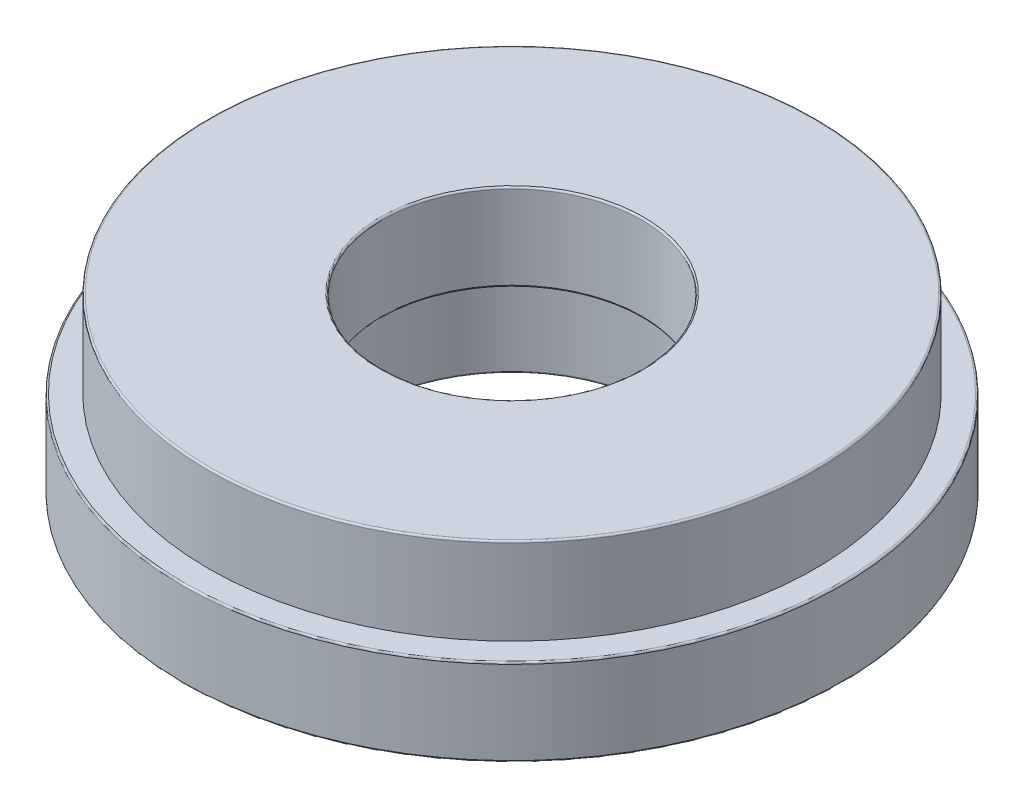
ISO-10303-21;
HEADER;
FILE_DESCRIPTION(('STEP AP214'),'2;1');
FILE_NAME('part.step','',(''),(''),'','','');
FILE_SCHEMA(('AUTOMOTIVE_DESIGN { 1 0 10303 214 1 1 1 1 }'));
ENDSEC;
DATA;
#1=APPLICATION_CONTEXT('core data for automotive mechanical design processes');
#2=APPLICATION_PROTOCOL_DEFINITION('international standard','automotive_design',2000,#1);
#3=PRODUCT_CONTEXT('',#1,'mechanical');
#4=PRODUCT('Part','Part','',(#3));
#5=PRODUCT_RELATED_PRODUCT_CATEGORY('part','',(#4));
#6=PRODUCT_DEFINITION_FORMATION('','',#4);
#7=PRODUCT_DEFINITION_CONTEXT('part definition',#1,'design');
#8=PRODUCT_DEFINITION('design','',#6,#7);
#9=PRODUCT_DEFINITION_SHAPE('','',#8);
#10=(LENGTH_UNIT() NAMED_UNIT(*) SI_UNIT(.MILLI.,.METRE.));
#11=(NAMED_UNIT(*) PLANE_ANGLE_UNIT() SI_UNIT($,.RADIAN.));
#12=(NAMED_UNIT(*) SI_UNIT($,.STERADIAN.) SOLID_ANGLE_UNIT());
#13=UNCERTAINTY_MEASURE_WITH_UNIT(LENGTH_MEASURE(1.E-05),#10,'distance_accuracy_value','');
#14=(GEOMETRIC_REPRESENTATION_CONTEXT(3) GLOBAL_UNCERTAINTY_ASSIGNED_CONTEXT((#13)) GLOBAL_UNIT_ASSIGNED_CONTEXT((#10,
#11,#12)) REPRESENTATION_CONTEXT('',''));
#15=CARTESIAN_POINT('',(0.,0.,0.));
#16=DIRECTION('',(0.,0.,1.));
#17=DIRECTION('',(1.,0.,0.));
#18=AXIS2_PLACEMENT_3D('',#15,#16,#17);
#19=CARTESIAN_POINT('',(0.,5.,0.));
#20=DIRECTION('',(0.,-1.,0.));
#21=DIRECTION('',(0.,0.,-1.));
#22=AXIS2_PLACEMENT_3D('',#19,#20,#21);
#23=CYLINDRICAL_SURFACE('',#22,19.);
#24=CARTESIAN_POINT('',(0.,0.1,0.));
#25=DIRECTION('',(0.,1.,0.));
#26=DIRECTION('',(0.,0.,1.));
#27=AXIS2_PLACEMENT_3D('',#24,#25,#26);
#28=CIRCLE('',#27,19.);
#29=CARTESIAN_POINT('',(0.,0.1,19.));
#30=VERTEX_POINT('',#29);
#31=EDGE_CURVE('E46',#30,#30,#28,.T.);
#32=ORIENTED_EDGE('',*,*,#31,.T.);
#33=EDGE_LOOP('',(#32));
#34=FACE_BOUND('',#33,.T.);
#35=CARTESIAN_POINT('',(0.,4.9,0.));
#36=DIRECTION('',(0.,1.,0.));
#37=DIRECTION('',(0.,0.,1.));
#38=AXIS2_PLACEMENT_3D('',#35,#36,#37);
#39=CIRCLE('',#38,19.);
#40=CARTESIAN_POINT('',(0.,4.9,19.));
#41=VERTEX_POINT('',#40);
#42=EDGE_CURVE('E50',#41,#41,#39,.F.);
#43=ORIENTED_EDGE('',*,*,#42,.T.);
#44=EDGE_LOOP('',(#43));
#45=FACE_BOUND('',#44,.T.);
#46=ADVANCED_FACE('F39',(#34,#45),#23,.T.);
#47=CARTESIAN_POINT('',(0.,5.,0.));
#48=DIRECTION('',(0.,1.,0.));
#49=DIRECTION('',(0.,0.,1.));
#50=AXIS2_PLACEMENT_3D('',#47,#48,#49);
#51=PLANE('',#50);
#52=CARTESIAN_POINT('',(0.,5.,0.));
#53=DIRECTION('',(0.,1.,0.));
#54=DIRECTION('',(0.,0.,1.));
#55=AXIS2_PLACEMENT_3D('',#52,#53,#54);
#56=CIRCLE('',#55,18.9);
#57=CARTESIAN_POINT('',(0.,5.,18.9));
#58=VERTEX_POINT('',#57);
#59=EDGE_CURVE('E11',#58,#58,#56,.T.);
#60=ORIENTED_EDGE('',*,*,#59,.T.);
#61=EDGE_LOOP('',(#60));
#62=FACE_BOUND('',#61,.T.);
#63=CARTESIAN_POINT('',(0.,5.,0.));
#64=DIRECTION('',(0.,1.,0.));
#65=DIRECTION('',(0.,0.,1.));
#66=AXIS2_PLACEMENT_3D('',#63,#64,#65);
#67=CIRCLE('',#66,17.5);
#68=CARTESIAN_POINT('',(0.,5.,17.5));
#69=VERTEX_POINT('',#68);
#70=EDGE_CURVE('E127',#69,#69,#67,.T.);
#71=ORIENTED_EDGE('',*,*,#70,.F.);
#72=EDGE_LOOP('',(#71));
#73=FACE_BOUND('',#72,.T.);
#74=ADVANCED_FACE('F162',(#62,#73),#51,.T.);
#75=CARTESIAN_POINT('',(0.,0.,0.));
#76=DIRECTION('',(0.,1.,0.));
#77=DIRECTION('',(0.,0.,1.));
#78=AXIS2_PLACEMENT_3D('',#75,#76,#77);
#79=PLANE('',#78);
#80=CARTESIAN_POINT('',(-12.9903810567666,0.,-7.49999999999999));
#81=DIRECTION('',(0.,1.,0.));
#82=DIRECTION('',(0.,0.,1.));
#83=AXIS2_PLACEMENT_3D('',#80,#81,#82);
#84=CIRCLE('',#83,3.15);
#85=CARTESIAN_POINT('',(-12.9903810567666,0.,-4.34999999999999));
#86=VERTEX_POINT('',#85);
#87=EDGE_CURVE('E86',#86,#86,#84,.T.);
#88=ORIENTED_EDGE('',*,*,#87,.T.);
#89=EDGE_LOOP('',(#88));
#90=FACE_BOUND('',#89,.T.);
#91=CARTESIAN_POINT('',(-12.9903810567666,0.,7.50000000000001));
#92=DIRECTION('',(0.,1.,0.));
#93=DIRECTION('',(0.,0.,1.));
#94=AXIS2_PLACEMENT_3D('',#91,#92,#93);
#95=CIRCLE('',#94,3.15);
#96=CARTESIAN_POINT('',(-12.9903810567666,0.,10.65));
#97=VERTEX_POINT('',#96);
#98=EDGE_CURVE('E89',#97,#97,#95,.T.);
#99=ORIENTED_EDGE('',*,*,#98,.T.);
#100=EDGE_LOOP('',(#99));
#101=FACE_BOUND('',#100,.T.);
#102=CARTESIAN_POINT('',(0.,0.,15.));
#103=DIRECTION('',(0.,1.,0.));
#104=DIRECTION('',(0.,0.,1.));
#105=AXIS2_PLACEMENT_3D('',#102,#103,#104);
#106=CIRCLE('',#105,3.15);
#107=CARTESIAN_POINT('',(0.,0.,18.15));
#108=VERTEX_POINT('',#107);
#109=EDGE_CURVE('E92',#108,#108,#106,.T.);
#110=ORIENTED_EDGE('',*,*,#109,.T.);
#111=EDGE_LOOP('',(#110));
#112=FACE_BOUND('',#111,.T.);
#113=CARTESIAN_POINT('',(12.9903810567666,0.,7.5));
#114=DIRECTION('',(0.,1.,0.));
#115=DIRECTION('',(0.,0.,1.));
#116=AXIS2_PLACEMENT_3D('',#113,#114,#115);
#117=CIRCLE('',#116,3.15);
#118=CARTESIAN_POINT('',(12.9903810567666,0.,10.65));
#119=VERTEX_POINT('',#118);
#120=EDGE_CURVE('E95',#119,#119,#117,.T.);
#121=ORIENTED_EDGE('',*,*,#120,.T.);
#122=EDGE_LOOP('',(#121));
#123=FACE_BOUND('',#122,.T.);
#124=CARTESIAN_POINT('',(12.9903810567666,0.,-7.50000000000001));
#125=DIRECTION('',(0.,1.,0.));
#126=DIRECTION('',(0.,0.,1.));
#127=AXIS2_PLACEMENT_3D('',#124,#125,#126);
#128=CIRCLE('',#127,3.15);
#129=CARTESIAN_POINT('',(12.9903810567666,0.,-4.35));
#130=VERTEX_POINT('',#129);
#131=EDGE_CURVE('E98',#130,#130,#128,.T.);
#132=ORIENTED_EDGE('',*,*,#131,.T.);
#133=EDGE_LOOP('',(#132));
#134=FACE_BOUND('',#133,.T.);
#135=CARTESIAN_POINT('',(0.,0.,-15.));
#136=DIRECTION('',(0.,1.,0.));
#137=DIRECTION('',(0.,0.,1.));
#138=AXIS2_PLACEMENT_3D('',#135,#136,#137);
#139=CIRCLE('',#138,3.15);
#140=CARTESIAN_POINT('',(0.,0.,-11.85));
#141=VERTEX_POINT('',#140);
#142=EDGE_CURVE('E101',#141,#141,#139,.T.);
#143=ORIENTED_EDGE('',*,*,#142,.T.);
#144=EDGE_LOOP('',(#143));
#145=FACE_BOUND('',#144,.T.);
#146=CARTESIAN_POINT('',(0.,0.,0.));
#147=DIRECTION('',(0.,1.,0.));
#148=DIRECTION('',(0.,0.,1.));
#149=AXIS2_PLACEMENT_3D('',#146,#147,#148);
#150=CIRCLE('',#149,8.6);
#151=CARTESIAN_POINT('',(0.,0.,8.6));
#152=VERTEX_POINT('',#151);
#153=EDGE_CURVE('E104',#152,#152,#150,.T.);
#154=ORIENTED_EDGE('',*,*,#153,.T.);
#155=EDGE_LOOP('',(#154));
#156=FACE_BOUND('',#155,.T.);
#157=CARTESIAN_POINT('',(0.,0.,0.));
#158=DIRECTION('',(0.,1.,0.));
#159=DIRECTION('',(0.,0.,1.));
#160=AXIS2_PLACEMENT_3D('',#157,#158,#159);
#161=CIRCLE('',#160,18.9);
#162=CARTESIAN_POINT('',(0.,0.,18.9));
#163=VERTEX_POINT('',#162);
#164=EDGE_CURVE('E107',#163,#163,#161,.F.);
#165=ORIENTED_EDGE('',*,*,#164,.T.);
#166=EDGE_LOOP('',(#165));
#167=FACE_BOUND('',#166,.T.);
#168=ADVANCED_FACE('F167',(#90,#101,#112,#123,#134,#145,#156,#167),#79,.F.);
#169=CARTESIAN_POINT('',(-12.9903810567666,4.,-7.49999999999999));
#170=DIRECTION('',(0.,-1.,0.));
#171=DIRECTION('',(0.,0.,-1.));
#172=AXIS2_PLACEMENT_3D('',#169,#170,#171);
#173=CYLINDRICAL_SURFACE('',#172,3.05);
#174=CARTESIAN_POINT('',(-12.9903810567666,0.0999999999999998,-7.49999999999999));
#175=DIRECTION('',(0.,1.,0.));
#176=DIRECTION('',(0.,0.,1.));
#177=AXIS2_PLACEMENT_3D('',#174,#175,#176);
#178=CIRCLE('',#177,3.05);
#179=CARTESIAN_POINT('',(-12.9903810567666,0.0999999999999998,-4.44999999999999));
#180=VERTEX_POINT('',#179);
#181=EDGE_CURVE('E83',#180,#180,#178,.F.);
#182=ORIENTED_EDGE('',*,*,#181,.T.);
#183=EDGE_LOOP('',(#182));
#184=FACE_BOUND('',#183,.T.);
#185=CARTESIAN_POINT('',(-12.9903810567666,4.,-7.49999999999999));
#186=DIRECTION('',(0.,1.,0.));
#187=DIRECTION('',(0.,0.,1.));
#188=AXIS2_PLACEMENT_3D('',#185,#186,#187);
#189=CIRCLE('',#188,3.05);
#190=CARTESIAN_POINT('',(-12.9903810567666,4.,-4.44999999999999));
#191=VERTEX_POINT('',#190);
#192=EDGE_CURVE('E119',#191,#191,#189,.T.);
#193=ORIENTED_EDGE('',*,*,#192,.T.);
#194=EDGE_LOOP('',(#193));
#195=FACE_BOUND('',#194,.T.);
#196=ADVANCED_FACE('F217',(#184,#195),#173,.F.);
#197=CARTESIAN_POINT('',(0.,4.,0.));
#198=DIRECTION('',(0.,1.,0.));
#199=DIRECTION('',(0.,0.,1.));
#200=AXIS2_PLACEMENT_3D('',#197,#198,#199);
#201=PLANE('',#200);
#202=ORIENTED_EDGE('',*,*,#192,.F.);
#203=EDGE_LOOP('',(#202));
#204=FACE_BOUND('',#203,.T.);
#205=ADVANCED_FACE('F222',(#204),#201,.F.);
#206=CARTESIAN_POINT('',(-12.9903810567666,4.,7.50000000000001));
#207=DIRECTION('',(0.,-1.,0.));
#208=DIRECTION('',(0.,0.,-1.));
#209=AXIS2_PLACEMENT_3D('',#206,#207,#208);
#210=CYLINDRICAL_SURFACE('',#209,3.05);
#211=CARTESIAN_POINT('',(-12.9903810567666,0.0999999999999998,7.50000000000001));
#212=DIRECTION('',(0.,1.,0.));
#213=DIRECTION('',(0.,0.,1.));
#214=AXIS2_PLACEMENT_3D('',#211,#212,#213);
#215=CIRCLE('',#214,3.05);
#216=CARTESIAN_POINT('',(-12.9903810567666,0.0999999999999998,10.55));
#217=VERTEX_POINT('',#216);
#218=EDGE_CURVE('E80',#217,#217,#215,.F.);
#219=ORIENTED_EDGE('',*,*,#218,.T.);
#220=EDGE_LOOP('',(#219));
#221=FACE_BOUND('',#220,.T.);
#222=CARTESIAN_POINT('',(-12.9903810567666,4.,7.50000000000001));
#223=DIRECTION('',(0.,1.,0.));
#224=DIRECTION('',(0.,0.,1.));
#225=AXIS2_PLACEMENT_3D('',#222,#223,#224);
#226=CIRCLE('',#225,3.05);
#227=CARTESIAN_POINT('',(-12.9903810567666,4.,10.55));
#228=VERTEX_POINT('',#227);
#229=EDGE_CURVE('E122',#228,#228,#226,.T.);
#230=ORIENTED_EDGE('',*,*,#229,.T.);
#231=EDGE_LOOP('',(#230));
#232=FACE_BOUND('',#231,.T.);
#233=ADVANCED_FACE('F249',(#221,#232),#210,.F.);
#234=CARTESIAN_POINT('',(0.,4.,0.));
#235=DIRECTION('',(0.,1.,0.));
#236=DIRECTION('',(0.,0.,1.));
#237=AXIS2_PLACEMENT_3D('',#234,#235,#236);
#238=PLANE('',#237);
#239=ORIENTED_EDGE('',*,*,#229,.F.);
#240=EDGE_LOOP('',(#239));
#241=FACE_BOUND('',#240,.T.);
#242=ADVANCED_FACE('F283',(#241),#238,.F.);
#243=CARTESIAN_POINT('',(0.,4.,15.));
#244=DIRECTION('',(0.,-1.,0.));
#245=DIRECTION('',(0.,0.,-1.));
#246=AXIS2_PLACEMENT_3D('',#243,#244,#245);
#247=CYLINDRICAL_SURFACE('',#246,3.05);
#248=CARTESIAN_POINT('',(0.,0.0999999999999998,15.));
#249=DIRECTION('',(0.,1.,0.));
#250=DIRECTION('',(0.,0.,1.));
#251=AXIS2_PLACEMENT_3D('',#248,#249,#250);
#252=CIRCLE('',#251,3.05);
#253=CARTESIAN_POINT('',(0.,0.0999999999999998,18.05));
#254=VERTEX_POINT('',#253);
#255=EDGE_CURVE('E77',#254,#254,#252,.F.);
#256=ORIENTED_EDGE('',*,*,#255,.T.);
#257=EDGE_LOOP('',(#256));
#258=FACE_BOUND('',#257,.T.);
#259=CARTESIAN_POINT('',(0.,4.,15.));
#260=DIRECTION('',(0.,1.,0.));
#261=DIRECTION('',(0.,0.,1.));
#262=AXIS2_PLACEMENT_3D('',#259,#260,#261);
#263=CIRCLE('',#262,3.05);
#264=CARTESIAN_POINT('',(0.,4.,18.05));
#265=VERTEX_POINT('',#264);
#266=EDGE_CURVE('E133',#265,#265,#263,.T.);
#267=ORIENTED_EDGE('',*,*,#266,.T.);
#268=EDGE_LOOP('',(#267));
#269=FACE_BOUND('',#268,.T.);
#270=ADVANCED_FACE('F280',(#258,#269),#247,.F.);
#271=CARTESIAN_POINT('',(0.,4.,0.));
#272=DIRECTION('',(0.,1.,0.));
#273=DIRECTION('',(0.,0.,1.));
#274=AXIS2_PLACEMENT_3D('',#271,#272,#273);
#275=PLANE('',#274);
#276=ORIENTED_EDGE('',*,*,#266,.F.);
#277=EDGE_LOOP('',(#276));
#278=FACE_BOUND('',#277,.T.);
#279=ADVANCED_FACE('F275',(#278),#275,.F.);
#280=CARTESIAN_POINT('',(12.9903810567666,4.,7.5));
#281=DIRECTION('',(0.,-1.,0.));
#282=DIRECTION('',(0.,0.,-1.));
#283=AXIS2_PLACEMENT_3D('',#280,#281,#282);
#284=CYLINDRICAL_SURFACE('',#283,3.05);
#285=CARTESIAN_POINT('',(12.9903810567666,0.0999999999999998,7.5));
#286=DIRECTION('',(0.,1.,0.));
#287=DIRECTION('',(0.,0.,1.));
#288=AXIS2_PLACEMENT_3D('',#285,#286,#287);
#289=CIRCLE('',#288,3.05);
#290=CARTESIAN_POINT('',(12.9903810567666,0.0999999999999998,10.55));
#291=VERTEX_POINT('',#290);
#292=EDGE_CURVE('E74',#291,#291,#289,.F.);
#293=ORIENTED_EDGE('',*,*,#292,.T.);
#294=EDGE_LOOP('',(#293));
#295=FACE_BOUND('',#294,.T.);
#296=CARTESIAN_POINT('',(12.9903810567666,4.,7.5));
#297=DIRECTION('',(0.,1.,0.));
#298=DIRECTION('',(0.,0.,1.));
#299=AXIS2_PLACEMENT_3D('',#296,#297,#298);
#300=CIRCLE('',#299,3.05);
#301=CARTESIAN_POINT('',(12.9903810567666,4.,10.55));
#302=VERTEX_POINT('',#301);
#303=EDGE_CURVE('E130',#302,#302,#300,.T.);
#304=ORIENTED_EDGE('',*,*,#303,.T.);
#305=EDGE_LOOP('',(#304));
#306=FACE_BOUND('',#305,.T.);
#307=ADVANCED_FACE('F272',(#295,#306),#284,.F.);
#308=CARTESIAN_POINT('',(0.,4.,0.));
#309=DIRECTION('',(0.,1.,0.));
#310=DIRECTION('',(0.,0.,1.));
#311=AXIS2_PLACEMENT_3D('',#308,#309,#310);
#312=PLANE('',#311);
#313=ORIENTED_EDGE('',*,*,#303,.F.);
#314=EDGE_LOOP('',(#313));
#315=FACE_BOUND('',#314,.T.);
#316=ADVANCED_FACE('F267',(#315),#312,.F.);
#317=CARTESIAN_POINT('',(12.9903810567666,4.,-7.50000000000001));
#318=DIRECTION('',(0.,-1.,0.));
#319=DIRECTION('',(0.,0.,-1.));
#320=AXIS2_PLACEMENT_3D('',#317,#318,#319);
#321=CYLINDRICAL_SURFACE('',#320,3.05);
#322=CARTESIAN_POINT('',(12.9903810567666,0.0999999999999998,-7.50000000000001));
#323=DIRECTION('',(0.,1.,0.));
#324=DIRECTION('',(0.,0.,1.));
#325=AXIS2_PLACEMENT_3D('',#322,#323,#324);
#326=CIRCLE('',#325,3.05);
#327=CARTESIAN_POINT('',(12.9903810567666,0.0999999999999998,-4.45000000000001));
#328=VERTEX_POINT('',#327);
#329=EDGE_CURVE('E71',#328,#328,#326,.F.);
#330=ORIENTED_EDGE('',*,*,#329,.T.);
#331=EDGE_LOOP('',(#330));
#332=FACE_BOUND('',#331,.T.);
#333=CARTESIAN_POINT('',(12.9903810567666,4.,-7.50000000000001));
#334=DIRECTION('',(0.,1.,0.));
#335=DIRECTION('',(0.,0.,1.));
#336=AXIS2_PLACEMENT_3D('',#333,#334,#335);
#337=CIRCLE('',#336,3.05);
#338=CARTESIAN_POINT('',(12.9903810567666,4.,-4.45000000000001));
#339=VERTEX_POINT('',#338);
#340=EDGE_CURVE('E126',#339,#339,#337,.T.);
#341=ORIENTED_EDGE('',*,*,#340,.T.);
#342=EDGE_LOOP('',(#341));
#343=FACE_BOUND('',#342,.T.);
#344=ADVANCED_FACE('F264',(#332,#343),#321,.F.);
#345=CARTESIAN_POINT('',(0.,4.,0.));
#346=DIRECTION('',(0.,1.,0.));
#347=DIRECTION('',(0.,0.,1.));
#348=AXIS2_PLACEMENT_3D('',#345,#346,#347);
#349=PLANE('',#348);
#350=ORIENTED_EDGE('',*,*,#340,.F.);
#351=EDGE_LOOP('',(#350));
#352=FACE_BOUND('',#351,.T.);
#353=ADVANCED_FACE('F258',(#352),#349,.F.);
#354=CARTESIAN_POINT('',(0.,4.,-15.));
#355=DIRECTION('',(0.,-1.,0.));
#356=DIRECTION('',(0.,0.,-1.));
#357=AXIS2_PLACEMENT_3D('',#354,#355,#356);
#358=CYLINDRICAL_SURFACE('',#357,3.05);
#359=CARTESIAN_POINT('',(0.,0.0999999999999998,-15.));
#360=DIRECTION('',(0.,1.,0.));
#361=DIRECTION('',(0.,0.,1.));
#362=AXIS2_PLACEMENT_3D('',#359,#360,#361);
#363=CIRCLE('',#362,3.05);
#364=CARTESIAN_POINT('',(0.,0.0999999999999998,-11.95));
#365=VERTEX_POINT('',#364);
#366=EDGE_CURVE('E68',#365,#365,#363,.F.);
#367=ORIENTED_EDGE('',*,*,#366,.T.);
#368=EDGE_LOOP('',(#367));
#369=FACE_BOUND('',#368,.T.);
#370=CARTESIAN_POINT('',(0.,4.,-15.));
#371=DIRECTION('',(0.,1.,0.));
#372=DIRECTION('',(0.,0.,1.));
#373=AXIS2_PLACEMENT_3D('',#370,#371,#372);
#374=CIRCLE('',#373,3.05);
#375=CARTESIAN_POINT('',(0.,4.,-11.95));
#376=VERTEX_POINT('',#375);
#377=EDGE_CURVE('E123',#376,#376,#374,.T.);
#378=ORIENTED_EDGE('',*,*,#377,.T.);
#379=EDGE_LOOP('',(#378));
#380=FACE_BOUND('',#379,.T.);
#381=ADVANCED_FACE('F254',(#369,#380),#358,.F.);
#382=CARTESIAN_POINT('',(0.,4.,0.));
#383=DIRECTION('',(0.,1.,0.));
#384=DIRECTION('',(0.,0.,1.));
#385=AXIS2_PLACEMENT_3D('',#382,#383,#384);
#386=PLANE('',#385);
#387=ORIENTED_EDGE('',*,*,#377,.F.);
#388=EDGE_LOOP('',(#387));
#389=FACE_BOUND('',#388,.T.);
#390=ADVANCED_FACE('F257',(#389),#386,.F.);
#391=CARTESIAN_POINT('',(0.,10.,0.));
#392=DIRECTION('',(0.,1.,0.));
#393=DIRECTION('',(0.,0.,1.));
#394=AXIS2_PLACEMENT_3D('',#391,#392,#393);
#395=PLANE('',#394);
#396=CARTESIAN_POINT('',(0.,10.,0.));
#397=DIRECTION('',(0.,1.,0.));
#398=DIRECTION('',(0.,0.,1.));
#399=AXIS2_PLACEMENT_3D('',#396,#397,#398);
#400=CIRCLE('',#399,7.6);
#401=CARTESIAN_POINT('',(0.,10.,7.6));
#402=VERTEX_POINT('',#401);
#403=EDGE_CURVE('E59',#402,#402,#400,.F.);
#404=ORIENTED_EDGE('',*,*,#403,.T.);
#405=EDGE_LOOP('',(#404));
#406=FACE_BOUND('',#405,.T.);
#407=CARTESIAN_POINT('',(0.,10.,0.));
#408=DIRECTION('',(0.,1.,0.));
#409=DIRECTION('',(0.,0.,1.));
#410=AXIS2_PLACEMENT_3D('',#407,#408,#409);
#411=CIRCLE('',#410,17.4);
#412=CARTESIAN_POINT('',(0.,10.,17.4));
#413=VERTEX_POINT('',#412);
#414=EDGE_CURVE('E62',#413,#413,#411,.T.);
#415=ORIENTED_EDGE('',*,*,#414,.T.);
#416=EDGE_LOOP('',(#415));
#417=FACE_BOUND('',#416,.T.);
#418=ADVANCED_FACE('F262',(#406,#417),#395,.T.);
#419=CARTESIAN_POINT('',(0.,10.,0.));
#420=DIRECTION('',(0.,-1.,0.));
#421=DIRECTION('',(0.,0.,-1.));
#422=AXIS2_PLACEMENT_3D('',#419,#420,#421);
#423=CYLINDRICAL_SURFACE('',#422,17.5);
#424=CARTESIAN_POINT('',(0.,9.9,0.));
#425=DIRECTION('',(0.,1.,0.));
#426=DIRECTION('',(0.,0.,1.));
#427=AXIS2_PLACEMENT_3D('',#424,#425,#426);
#428=CIRCLE('',#427,17.5);
#429=CARTESIAN_POINT('',(0.,9.9,17.5));
#430=VERTEX_POINT('',#429);
#431=EDGE_CURVE('E54',#430,#430,#428,.F.);
#432=ORIENTED_EDGE('',*,*,#431,.T.);
#433=EDGE_LOOP('',(#432));
#434=FACE_BOUND('',#433,.T.);
#435=ORIENTED_EDGE('',*,*,#70,.T.);
#436=EDGE_LOOP('',(#435));
#437=FACE_BOUND('',#436,.T.);
#438=ADVANCED_FACE('F294',(#434,#437),#423,.T.);
#439=CARTESIAN_POINT('',(0.,10.,0.));
#440=DIRECTION('',(0.,-1.,0.));
#441=DIRECTION('',(0.,0.,-1.));
#442=AXIS2_PLACEMENT_3D('',#439,#440,#441);
#443=CYLINDRICAL_SURFACE('',#442,7.5);
#444=CARTESIAN_POINT('',(0.,5.1,0.));
#445=DIRECTION('',(0.,1.,0.));
#446=DIRECTION('',(0.,0.,1.));
#447=AXIS2_PLACEMENT_3D('',#444,#445,#446);
#448=CIRCLE('',#447,7.5);
#449=CARTESIAN_POINT('',(0.,5.1,7.5));
#450=VERTEX_POINT('',#449);
#451=EDGE_CURVE('E113',#450,#450,#448,.F.);
#452=ORIENTED_EDGE('',*,*,#451,.T.);
#453=EDGE_LOOP('',(#452));
#454=FACE_BOUND('',#453,.T.);
#455=CARTESIAN_POINT('',(0.,9.9,0.));
#456=DIRECTION('',(0.,1.,0.));
#457=DIRECTION('',(0.,0.,1.));
#458=AXIS2_PLACEMENT_3D('',#455,#456,#457);
#459=CIRCLE('',#458,7.5);
#460=CARTESIAN_POINT('',(0.,9.9,7.5));
#461=VERTEX_POINT('',#460);
#462=EDGE_CURVE('E116',#461,#461,#459,.T.);
#463=ORIENTED_EDGE('',*,*,#462,.T.);
#464=EDGE_LOOP('',(#463));
#465=FACE_BOUND('',#464,.T.);
#466=ADVANCED_FACE('F158',(#454,#465),#443,.F.);
#467=CARTESIAN_POINT('',(0.,5.,0.));
#468=DIRECTION('',(0.,1.,0.));
#469=DIRECTION('',(0.,0.,1.));
#470=AXIS2_PLACEMENT_3D('',#467,#468,#469);
#471=PLANE('',#470);
#472=CARTESIAN_POINT('',(0.,5.,0.));
#473=DIRECTION('',(0.,1.,0.));
#474=DIRECTION('',(0.,0.,1.));
#475=AXIS2_PLACEMENT_3D('',#472,#473,#474);
#476=CIRCLE('',#475,7.6);
#477=CARTESIAN_POINT('',(0.,5.,7.6));
#478=VERTEX_POINT('',#477);
#479=EDGE_CURVE('E110',#478,#478,#476,.T.);
#480=ORIENTED_EDGE('',*,*,#479,.T.);
#481=EDGE_LOOP('',(#480));
#482=FACE_BOUND('',#481,.T.);
#483=CARTESIAN_POINT('',(0.,5.,0.));
#484=DIRECTION('',(0.,1.,0.));
#485=DIRECTION('',(0.,0.,1.));
#486=AXIS2_PLACEMENT_3D('',#483,#484,#485);
#487=CIRCLE('',#486,8.5);
#488=CARTESIAN_POINT('',(0.,5.,8.5));
#489=VERTEX_POINT('',#488);
#490=EDGE_CURVE('E140',#489,#489,#487,.F.);
#491=ORIENTED_EDGE('',*,*,#490,.T.);
#492=EDGE_LOOP('',(#491));
#493=FACE_BOUND('',#492,.T.);
#494=ADVANCED_FACE('F144',(#482,#493),#471,.F.);
#495=CARTESIAN_POINT('',(0.,34.0416305603426,0.));
#496=DIRECTION('',(0.,-1.,0.));
#497=DIRECTION('',(0.,0.,-1.));
#498=AXIS2_PLACEMENT_3D('',#495,#496,#497);
#499=CYLINDRICAL_SURFACE('',#498,8.5);
#500=CARTESIAN_POINT('',(0.,0.100000000000003,0.));
#501=DIRECTION('',(0.,1.,0.));
#502=DIRECTION('',(0.,0.,1.));
#503=AXIS2_PLACEMENT_3D('',#500,#501,#502);
#504=CIRCLE('',#503,8.5);
#505=CARTESIAN_POINT('',(0.,0.100000000000003,8.5));
#506=VERTEX_POINT('',#505);
#507=EDGE_CURVE('E65',#506,#506,#504,.F.);
#508=ORIENTED_EDGE('',*,*,#507,.T.);
#509=EDGE_LOOP('',(#508));
#510=FACE_BOUND('',#509,.T.);
#511=ORIENTED_EDGE('',*,*,#490,.F.);
#512=EDGE_LOOP('',(#511));
#513=FACE_BOUND('',#512,.T.);
#514=ADVANCED_FACE('F146',(#510,#513),#499,.F.);
#515=CARTESIAN_POINT('',(0.,5.1,0.));
#516=DIRECTION('',(0.,1.,0.));
#517=DIRECTION('',(0.,0.,1.));
#518=AXIS2_PLACEMENT_3D('',#515,#516,#517);
#519=TOROIDAL_SURFACE('',#518,7.6,0.1);
#520=ORIENTED_EDGE('',*,*,#479,.F.);
#521=EDGE_LOOP('',(#520));
#522=FACE_BOUND('',#521,.T.);
#523=ORIENTED_EDGE('',*,*,#451,.F.);
#524=EDGE_LOOP('',(#523));
#525=FACE_BOUND('',#524,.T.);
#526=ADVANCED_FACE('F148',(#522,#525),#519,.T.);
#527=CARTESIAN_POINT('',(-12.9903810567666,0.0999999999999998,-7.49999999999999));
#528=DIRECTION('',(0.,1.,0.));
#529=DIRECTION('',(0.,0.,1.));
#530=AXIS2_PLACEMENT_3D('',#527,#528,#529);
#531=TOROIDAL_SURFACE('',#530,3.15,0.1);
#532=ORIENTED_EDGE('',*,*,#181,.F.);
#533=EDGE_LOOP('',(#532));
#534=FACE_BOUND('',#533,.T.);
#535=ORIENTED_EDGE('',*,*,#87,.F.);
#536=EDGE_LOOP('',(#535));
#537=FACE_BOUND('',#536,.T.);
#538=ADVANCED_FACE('F155',(#534,#537),#531,.T.);
#539=CARTESIAN_POINT('',(-12.9903810567666,0.0999999999999998,7.50000000000001));
#540=DIRECTION('',(0.,1.,0.));
#541=DIRECTION('',(0.,0.,1.));
#542=AXIS2_PLACEMENT_3D('',#539,#540,#541);
#543=TOROIDAL_SURFACE('',#542,3.15,0.1);
#544=ORIENTED_EDGE('',*,*,#218,.F.);
#545=EDGE_LOOP('',(#544));
#546=FACE_BOUND('',#545,.T.);
#547=ORIENTED_EDGE('',*,*,#98,.F.);
#548=EDGE_LOOP('',(#547));
#549=FACE_BOUND('',#548,.T.);
#550=ADVANCED_FACE('F174',(#546,#549),#543,.T.);
#551=CARTESIAN_POINT('',(0.,0.0999999999999998,15.));
#552=DIRECTION('',(0.,1.,0.));
#553=DIRECTION('',(0.,0.,1.));
#554=AXIS2_PLACEMENT_3D('',#551,#552,#553);
#555=TOROIDAL_SURFACE('',#554,3.15,0.1);
#556=ORIENTED_EDGE('',*,*,#255,.F.);
#557=EDGE_LOOP('',(#556));
#558=FACE_BOUND('',#557,.T.);
#559=ORIENTED_EDGE('',*,*,#109,.F.);
#560=EDGE_LOOP('',(#559));
#561=FACE_BOUND('',#560,.T.);
#562=ADVANCED_FACE('F178',(#558,#561),#555,.T.);
#563=CARTESIAN_POINT('',(12.9903810567666,0.0999999999999998,7.5));
#564=DIRECTION('',(0.,1.,0.));
#565=DIRECTION('',(0.,0.,1.));
#566=AXIS2_PLACEMENT_3D('',#563,#564,#565);
#567=TOROIDAL_SURFACE('',#566,3.15,0.1);
#568=ORIENTED_EDGE('',*,*,#292,.F.);
#569=EDGE_LOOP('',(#568));
#570=FACE_BOUND('',#569,.T.);
#571=ORIENTED_EDGE('',*,*,#120,.F.);
#572=EDGE_LOOP('',(#571));
#573=FACE_BOUND('',#572,.T.);
#574=ADVANCED_FACE('F182',(#570,#573),#567,.T.);
#575=CARTESIAN_POINT('',(12.9903810567666,0.0999999999999998,-7.50000000000001));
#576=DIRECTION('',(0.,1.,0.));
#577=DIRECTION('',(0.,0.,1.));
#578=AXIS2_PLACEMENT_3D('',#575,#576,#577);
#579=TOROIDAL_SURFACE('',#578,3.15,0.1);
#580=ORIENTED_EDGE('',*,*,#329,.F.);
#581=EDGE_LOOP('',(#580));
#582=FACE_BOUND('',#581,.T.);
#583=ORIENTED_EDGE('',*,*,#131,.F.);
#584=EDGE_LOOP('',(#583));
#585=FACE_BOUND('',#584,.T.);
#586=ADVANCED_FACE('F186',(#582,#585),#579,.T.);
#587=CARTESIAN_POINT('',(0.,0.0999999999999998,-15.));
#588=DIRECTION('',(0.,1.,0.));
#589=DIRECTION('',(0.,0.,1.));
#590=AXIS2_PLACEMENT_3D('',#587,#588,#589);
#591=TOROIDAL_SURFACE('',#590,3.15,0.1);
#592=ORIENTED_EDGE('',*,*,#366,.F.);
#593=EDGE_LOOP('',(#592));
#594=FACE_BOUND('',#593,.T.);
#595=ORIENTED_EDGE('',*,*,#142,.F.);
#596=EDGE_LOOP('',(#595));
#597=FACE_BOUND('',#596,.T.);
#598=ADVANCED_FACE('F190',(#594,#597),#591,.T.);
#599=CARTESIAN_POINT('',(0.,0.100000000000003,0.));
#600=DIRECTION('',(0.,1.,0.));
#601=DIRECTION('',(0.,0.,1.));
#602=AXIS2_PLACEMENT_3D('',#599,#600,#601);
#603=TOROIDAL_SURFACE('',#602,8.6,0.1);
#604=ORIENTED_EDGE('',*,*,#153,.F.);
#605=EDGE_LOOP('',(#604));
#606=FACE_BOUND('',#605,.T.);
#607=ORIENTED_EDGE('',*,*,#507,.F.);
#608=EDGE_LOOP('',(#607));
#609=FACE_BOUND('',#608,.T.);
#610=ADVANCED_FACE('F194',(#606,#609),#603,.T.);
#611=CARTESIAN_POINT('',(0.,9.9,0.));
#612=DIRECTION('',(0.,1.,0.));
#613=DIRECTION('',(0.,0.,1.));
#614=AXIS2_PLACEMENT_3D('',#611,#612,#613);
#615=TOROIDAL_SURFACE('',#614,7.6,0.1);
#616=ORIENTED_EDGE('',*,*,#403,.F.);
#617=EDGE_LOOP('',(#616));
#618=FACE_BOUND('',#617,.T.);
#619=ORIENTED_EDGE('',*,*,#462,.F.);
#620=EDGE_LOOP('',(#619));
#621=FACE_BOUND('',#620,.T.);
#622=ADVANCED_FACE('F198',(#618,#621),#615,.T.);
#623=CARTESIAN_POINT('',(0.,9.9,0.));
#624=DIRECTION('',(0.,1.,0.));
#625=DIRECTION('',(0.,0.,1.));
#626=AXIS2_PLACEMENT_3D('',#623,#624,#625);
#627=TOROIDAL_SURFACE('',#626,17.4,0.1);
#628=ORIENTED_EDGE('',*,*,#431,.F.);
#629=EDGE_LOOP('',(#628));
#630=FACE_BOUND('',#629,.T.);
#631=ORIENTED_EDGE('',*,*,#414,.F.);
#632=EDGE_LOOP('',(#631));
#633=FACE_BOUND('',#632,.T.);
#634=ADVANCED_FACE('F202',(#630,#633),#627,.T.);
#635=CARTESIAN_POINT('',(0.,0.1,0.));
#636=DIRECTION('',(0.,1.,0.));
#637=DIRECTION('',(0.,0.,1.));
#638=AXIS2_PLACEMENT_3D('',#635,#636,#637);
#639=TOROIDAL_SURFACE('',#638,18.9,0.1);
#640=ORIENTED_EDGE('',*,*,#164,.F.);
#641=EDGE_LOOP('',(#640));
#642=FACE_BOUND('',#641,.T.);
#643=ORIENTED_EDGE('',*,*,#31,.F.);
#644=EDGE_LOOP('',(#643));
#645=FACE_BOUND('',#644,.T.);
#646=ADVANCED_FACE('F205',(#642,#645),#639,.T.);
#647=CARTESIAN_POINT('',(0.,4.9,0.));
#648=DIRECTION('',(0.,1.,0.));
#649=DIRECTION('',(0.,0.,1.));
#650=AXIS2_PLACEMENT_3D('',#647,#648,#649);
#651=TOROIDAL_SURFACE('',#650,18.9,0.1);
#652=ORIENTED_EDGE('',*,*,#42,.F.);
#653=EDGE_LOOP('',(#652));
#654=FACE_BOUND('',#653,.T.);
#655=ORIENTED_EDGE('',*,*,#59,.F.);
#656=EDGE_LOOP('',(#655));
#657=FACE_BOUND('',#656,.T.);
#658=ADVANCED_FACE('F41',(#654,#657),#651,.T.);
#659=CLOSED_SHELL('',(#46,#74,#168,#196,#205,#233,#242,#270,#279,#307,#316,#344,#353,#381,#390,
#418,#438,#466,#494,#514,#526,#538,#550,#562,#574,#586,#598,#610,#622,#634,#646,#658));
#660=MANIFOLD_SOLID_BREP('B2',#659);
#661=ADVANCED_BREP_SHAPE_REPRESENTATION('',(#18,#660),#14);
#662=SHAPE_DEFINITION_REPRESENTATION(#9,#661);
ENDSEC;
END-ISO-10303-21;
